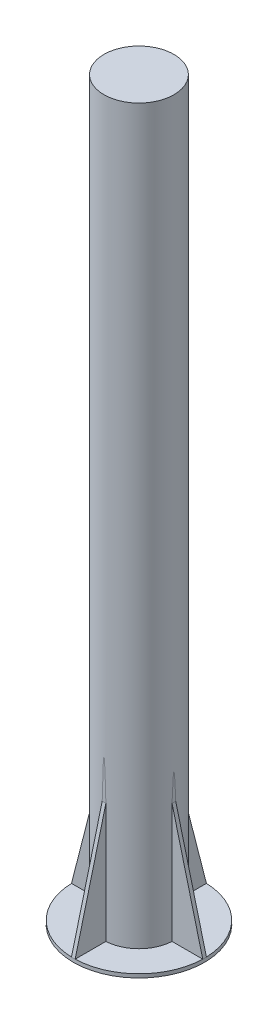
ISO-10303-21;
HEADER;
FILE_DESCRIPTION(('STEP AP214'),'2;1');
FILE_NAME('part.step','',(''),(''),'','','');
FILE_SCHEMA(('AUTOMOTIVE_DESIGN { 1 0 10303 214 1 1 1 1 }'));
ENDSEC;
DATA;
#1=APPLICATION_CONTEXT('core data for automotive mechanical design processes');
#2=APPLICATION_PROTOCOL_DEFINITION('international standard','automotive_design',2000,#1);
#3=PRODUCT_CONTEXT('',#1,'mechanical');
#4=PRODUCT('Part','Part','',(#3));
#5=PRODUCT_RELATED_PRODUCT_CATEGORY('part','',(#4));
#6=PRODUCT_DEFINITION_FORMATION('','',#4);
#7=PRODUCT_DEFINITION_CONTEXT('part definition',#1,'design');
#8=PRODUCT_DEFINITION('design','',#6,#7);
#9=PRODUCT_DEFINITION_SHAPE('','',#8);
#10=(LENGTH_UNIT() NAMED_UNIT(*) SI_UNIT(.MILLI.,.METRE.));
#11=(NAMED_UNIT(*) PLANE_ANGLE_UNIT() SI_UNIT($,.RADIAN.));
#12=(NAMED_UNIT(*) SI_UNIT($,.STERADIAN.) SOLID_ANGLE_UNIT());
#13=UNCERTAINTY_MEASURE_WITH_UNIT(LENGTH_MEASURE(1.E-05),#10,'distance_accuracy_value','');
#14=(GEOMETRIC_REPRESENTATION_CONTEXT(3) GLOBAL_UNCERTAINTY_ASSIGNED_CONTEXT((#13)) GLOBAL_UNIT_ASSIGNED_CONTEXT((#10,
#11,#12)) REPRESENTATION_CONTEXT('',''));
#15=CARTESIAN_POINT('',(0.,0.,0.));
#16=DIRECTION('',(0.,0.,1.));
#17=DIRECTION('',(1.,0.,0.));
#18=AXIS2_PLACEMENT_3D('',#15,#16,#17);
#19=CARTESIAN_POINT('',(0.,6.,0.));
#20=DIRECTION('',(0.,1.,0.));
#21=DIRECTION('',(0.,0.,1.));
#22=AXIS2_PLACEMENT_3D('',#19,#20,#21);
#23=PLANE('',#22);
#24=CARTESIAN_POINT('',(0.,6.,0.));
#25=DIRECTION('',(0.,1.,0.));
#26=DIRECTION('',(0.,0.,1.));
#27=AXIS2_PLACEMENT_3D('',#24,#25,#26);
#28=CIRCLE('',#27,57.);
#29=CARTESIAN_POINT('',(-56.9209978830308,6.00000000000001,3.));
#30=VERTEX_POINT('',#29);
#31=CARTESIAN_POINT('',(-2.99999999999997,6.00000000000001,56.9209978830308));
#32=VERTEX_POINT('',#31);
#33=EDGE_CURVE('E222',#30,#32,#28,.T.);
#34=ORIENTED_EDGE('',*,*,#33,.F.);
#35=DIRECTION('',(1.,0.,0.));
#36=VECTOR('',#35,1.);
#37=CARTESIAN_POINT('',(-107.,6.,3.));
#38=LINE('',#37,#36);
#39=CARTESIAN_POINT('',(-106.957935656967,6.,3.));
#40=VERTEX_POINT('',#39);
#41=EDGE_CURVE('E55',#40,#30,#38,.T.);
#42=ORIENTED_EDGE('',*,*,#41,.F.);
#43=CARTESIAN_POINT('',(0.,6.,0.));
#44=DIRECTION('',(0.,1.,0.));
#45=DIRECTION('',(0.,0.,1.));
#46=AXIS2_PLACEMENT_3D('',#43,#44,#45);
#47=CIRCLE('',#46,107.);
#48=CARTESIAN_POINT('',(-2.99999999999996,6.,106.957935656967));
#49=VERTEX_POINT('',#48);
#50=EDGE_CURVE('E227',#40,#49,#47,.T.);
#51=ORIENTED_EDGE('',*,*,#50,.T.);
#52=DIRECTION('',(0.,0.,1.));
#53=VECTOR('',#52,1.);
#54=CARTESIAN_POINT('',(-2.99999999999998,6.,3.));
#55=LINE('',#54,#53);
#56=EDGE_CURVE('E288',#32,#49,#55,.T.);
#57=ORIENTED_EDGE('',*,*,#56,.F.);
#58=EDGE_LOOP('',(#34,#42,#51,#57));
#59=FACE_BOUND('',#58,.T.);
#60=ADVANCED_FACE('F39',(#59),#23,.T.);
#61=CARTESIAN_POINT('',(3.00000000000003,6.00000000000001,56.9209978830308));
#62=VERTEX_POINT('',#61);
#63=CARTESIAN_POINT('',(56.9209978830308,6.00000000000001,3.));
#64=VERTEX_POINT('',#63);
#65=EDGE_CURVE('E216',#62,#64,#28,.T.);
#66=ORIENTED_EDGE('',*,*,#65,.F.);
#67=DIRECTION('',(0.,0.,-1.));
#68=VECTOR('',#67,1.);
#69=CARTESIAN_POINT('',(3.00000000000004,6.,107.));
#70=LINE('',#69,#68);
#71=CARTESIAN_POINT('',(3.00000000000004,6.,106.957935656967));
#72=VERTEX_POINT('',#71);
#73=EDGE_CURVE('E305',#72,#62,#70,.T.);
#74=ORIENTED_EDGE('',*,*,#73,.F.);
#75=CARTESIAN_POINT('',(106.957935656967,6.,3.));
#76=VERTEX_POINT('',#75);
#77=EDGE_CURVE('E226',#72,#76,#47,.T.);
#78=ORIENTED_EDGE('',*,*,#77,.T.);
#79=DIRECTION('',(1.,0.,0.));
#80=VECTOR('',#79,1.);
#81=CARTESIAN_POINT('',(3.00000000000002,6.,2.99999999999999));
#82=LINE('',#81,#80);
#83=EDGE_CURVE('E314',#64,#76,#82,.T.);
#84=ORIENTED_EDGE('',*,*,#83,.F.);
#85=EDGE_LOOP('',(#66,#74,#78,#84));
#86=FACE_BOUND('',#85,.T.);
#87=ADVANCED_FACE('F429',(#86),#23,.T.);
#88=CARTESIAN_POINT('',(56.9209978830308,6.00000000000001,-3.00000000000001));
#89=VERTEX_POINT('',#88);
#90=CARTESIAN_POINT('',(3.00000000000001,6.00000000000001,-56.9209978830308));
#91=VERTEX_POINT('',#90);
#92=EDGE_CURVE('E221',#89,#91,#28,.T.);
#93=ORIENTED_EDGE('',*,*,#92,.F.);
#94=DIRECTION('',(-1.,0.,0.));
#95=VECTOR('',#94,1.);
#96=CARTESIAN_POINT('',(107.,6.,-3.00000000000001));
#97=LINE('',#96,#95);
#98=CARTESIAN_POINT('',(106.957935656967,6.,-3.00000000000001));
#99=VERTEX_POINT('',#98);
#100=EDGE_CURVE('E258',#99,#89,#97,.T.);
#101=ORIENTED_EDGE('',*,*,#100,.F.);
#102=CARTESIAN_POINT('',(3.,6.,-106.957935656967));
#103=VERTEX_POINT('',#102);
#104=EDGE_CURVE('E334',#99,#103,#47,.T.);
#105=ORIENTED_EDGE('',*,*,#104,.T.);
#106=DIRECTION('',(0.,0.,-1.));
#107=VECTOR('',#106,1.);
#108=CARTESIAN_POINT('',(3.00000000000002,6.,-3.));
#109=LINE('',#108,#107);
#110=EDGE_CURVE('E180',#91,#103,#109,.T.);
#111=ORIENTED_EDGE('',*,*,#110,.F.);
#112=EDGE_LOOP('',(#93,#101,#105,#111));
#113=FACE_BOUND('',#112,.T.);
#114=ADVANCED_FACE('F269',(#113),#23,.T.);
#115=CARTESIAN_POINT('',(-2.99999999999999,6.00000000000001,-56.9209978830308));
#116=VERTEX_POINT('',#115);
#117=CARTESIAN_POINT('',(-56.9209978830308,6.00000000000001,-3.));
#118=VERTEX_POINT('',#117);
#119=EDGE_CURVE('E274',#116,#118,#28,.T.);
#120=ORIENTED_EDGE('',*,*,#119,.F.);
#121=DIRECTION('',(0.,0.,1.));
#122=VECTOR('',#121,1.);
#123=CARTESIAN_POINT('',(-3.,6.,-107.));
#124=LINE('',#123,#122);
#125=CARTESIAN_POINT('',(-3.,6.,-106.957935656967));
#126=VERTEX_POINT('',#125);
#127=EDGE_CURVE('E197',#126,#116,#124,.T.);
#128=ORIENTED_EDGE('',*,*,#127,.F.);
#129=CARTESIAN_POINT('',(-106.957935656967,6.,-3.));
#130=VERTEX_POINT('',#129);
#131=EDGE_CURVE('E340',#126,#130,#47,.T.);
#132=ORIENTED_EDGE('',*,*,#131,.T.);
#133=DIRECTION('',(-1.,0.,0.));
#134=VECTOR('',#133,1.);
#135=CARTESIAN_POINT('',(-2.99999999999998,6.,-3.));
#136=LINE('',#135,#134);
#137=EDGE_CURVE('E202',#118,#130,#136,.T.);
#138=ORIENTED_EDGE('',*,*,#137,.F.);
#139=EDGE_LOOP('',(#120,#128,#132,#138));
#140=FACE_BOUND('',#139,.T.);
#141=ADVANCED_FACE('F421',(#140),#23,.T.);
#142=CARTESIAN_POINT('',(0.,1200.,0.));
#143=DIRECTION('',(0.,-1.,0.));
#144=DIRECTION('',(0.,0.,-1.));
#145=AXIS2_PLACEMENT_3D('',#142,#143,#144);
#146=CYLINDRICAL_SURFACE('',#145,57.);
#147=DIRECTION('',(0.,-1.,0.));
#148=VECTOR('',#147,1.);
#149=CARTESIAN_POINT('',(3.00000000000001,1200.,-56.9209978830308));
#150=LINE('',#149,#148);
#151=CARTESIAN_POINT('',(3.,201.,-56.9209978830308));
#152=VERTEX_POINT('',#151);
#153=EDGE_CURVE('E245',#152,#91,#150,.T.);
#154=ORIENTED_EDGE('',*,*,#153,.F.);
#155=CARTESIAN_POINT('',(0.,-46487.07236168,0.));
#156=DIRECTION('',(0.,0.00121917553457105,0.999999256805232));
#157=DIRECTION('',(0.,-0.999999256805232,0.00121917553457105));
#158=AXIS2_PLACEMENT_3D('',#155,#156,#157);
#159=ELLIPSE('',#158,46752.9066846431,57.);
#160=CARTESIAN_POINT('',(-2.99999999999999,201.,-56.9209978830308));
#161=VERTEX_POINT('',#160);
#162=EDGE_CURVE('E405',#152,#161,#159,.T.);
#163=ORIENTED_EDGE('',*,*,#162,.T.);
#164=DIRECTION('',(0.,-1.,0.));
#165=VECTOR('',#164,1.);
#166=CARTESIAN_POINT('',(-2.99999999999999,1200.,-56.9209978830308));
#167=LINE('',#166,#165);
#168=EDGE_CURVE('E188',#116,#161,#167,.F.);
#169=ORIENTED_EDGE('',*,*,#168,.F.);
#170=ORIENTED_EDGE('',*,*,#119,.T.);
#171=DIRECTION('',(0.,-1.,0.));
#172=VECTOR('',#171,1.);
#173=CARTESIAN_POINT('',(-56.9209978830308,1200.,-3.));
#174=LINE('',#173,#172);
#175=CARTESIAN_POINT('',(-56.9209978830308,201.,-3.));
#176=VERTEX_POINT('',#175);
#177=EDGE_CURVE('E237',#176,#118,#174,.T.);
#178=ORIENTED_EDGE('',*,*,#177,.F.);
#179=CARTESIAN_POINT('',(0.,-30744.5451322641,0.));
#180=DIRECTION('',(0.999998308322249,0.00183938920279995,0.));
#181=DIRECTION('',(0.00183938920279995,-0.99999830832225,0.));
#182=AXIS2_PLACEMENT_3D('',#179,#180,#181);
#183=ELLIPSE('',#182,30988.5476729088,57.);
#184=CARTESIAN_POINT('',(-56.9209978830308,201.,3.));
#185=VERTEX_POINT('',#184);
#186=EDGE_CURVE('E372',#176,#185,#183,.T.);
#187=ORIENTED_EDGE('',*,*,#186,.T.);
#188=DIRECTION('',(0.,-1.,0.));
#189=VECTOR('',#188,1.);
#190=CARTESIAN_POINT('',(-56.9209978830308,1200.,3.));
#191=LINE('',#190,#189);
#192=EDGE_CURVE('E240',#30,#185,#191,.F.);
#193=ORIENTED_EDGE('',*,*,#192,.F.);
#194=ORIENTED_EDGE('',*,*,#33,.T.);
#195=DIRECTION('',(0.,-1.,0.));
#196=VECTOR('',#195,1.);
#197=CARTESIAN_POINT('',(-2.99999999999997,1200.,56.9209978830308));
#198=LINE('',#197,#196);
#199=CARTESIAN_POINT('',(-2.99999999999996,201.,56.9209978830308));
#200=VERTEX_POINT('',#199);
#201=EDGE_CURVE('E234',#200,#32,#198,.T.);
#202=ORIENTED_EDGE('',*,*,#201,.F.);
#203=CARTESIAN_POINT('',(0.,-46487.0723616801,0.));
#204=DIRECTION('',(0.,0.00121917553457105,-0.999999256805232));
#205=DIRECTION('',(0.,-0.999999256805232,-0.00121917553457105));
#206=AXIS2_PLACEMENT_3D('',#203,#204,#205);
#207=ELLIPSE('',#206,46752.9066846431,57.);
#208=CARTESIAN_POINT('',(3.00000000000003,201.,56.9209978830308));
#209=VERTEX_POINT('',#208);
#210=EDGE_CURVE('E393',#200,#209,#207,.T.);
#211=ORIENTED_EDGE('',*,*,#210,.T.);
#212=DIRECTION('',(0.,-1.,0.));
#213=VECTOR('',#212,1.);
#214=CARTESIAN_POINT('',(3.00000000000003,1200.,56.9209978830308));
#215=LINE('',#214,#213);
#216=EDGE_CURVE('E220',#62,#209,#215,.F.);
#217=ORIENTED_EDGE('',*,*,#216,.F.);
#218=ORIENTED_EDGE('',*,*,#65,.T.);
#219=DIRECTION('',(0.,-1.,0.));
#220=VECTOR('',#219,1.);
#221=CARTESIAN_POINT('',(56.9209978830308,1200.,3.));
#222=LINE('',#221,#220);
#223=CARTESIAN_POINT('',(56.9209978830308,201.,3.));
#224=VERTEX_POINT('',#223);
#225=EDGE_CURVE('E11',#224,#64,#222,.T.);
#226=ORIENTED_EDGE('',*,*,#225,.F.);
#227=CARTESIAN_POINT('',(0.,-30744.5451322614,0.));
#228=DIRECTION('',(-0.999998308322249,0.00183938920280011,0.));
#229=DIRECTION('',(-0.00183938920280011,-0.99999830832225,0.));
#230=AXIS2_PLACEMENT_3D('',#227,#228,#229);
#231=ELLIPSE('',#230,30988.5476729061,57.);
#232=CARTESIAN_POINT('',(56.9209978830308,201.,-3.));
#233=VERTEX_POINT('',#232);
#234=EDGE_CURVE('E266',#224,#233,#231,.T.);
#235=ORIENTED_EDGE('',*,*,#234,.T.);
#236=DIRECTION('',(0.,-1.,0.));
#237=VECTOR('',#236,1.);
#238=CARTESIAN_POINT('',(56.9209978830308,1200.,-3.00000000000001));
#239=LINE('',#238,#237);
#240=EDGE_CURVE('E48',#89,#233,#239,.F.);
#241=ORIENTED_EDGE('',*,*,#240,.F.);
#242=ORIENTED_EDGE('',*,*,#92,.T.);
#243=EDGE_LOOP('',(#154,#163,#169,#170,#178,#187,#193,#194,#202,#211,#217,#218,#226,#235,#241,#242));
#244=FACE_BOUND('',#243,.T.);
#245=CARTESIAN_POINT('',(0.,1200.,0.));
#246=DIRECTION('',(0.,1.,0.));
#247=DIRECTION('',(0.,0.,1.));
#248=AXIS2_PLACEMENT_3D('',#245,#246,#247);
#249=CIRCLE('',#248,57.);
#250=CARTESIAN_POINT('',(0.,1200.,57.));
#251=VERTEX_POINT('',#250);
#252=EDGE_CURVE('E211',#251,#251,#249,.T.);
#253=ORIENTED_EDGE('',*,*,#252,.F.);
#254=EDGE_LOOP('',(#253));
#255=FACE_BOUND('',#254,.T.);
#256=ADVANCED_FACE('F263',(#244,#255),#146,.T.);
#257=CARTESIAN_POINT('',(0.,6.,0.));
#258=DIRECTION('',(0.,-1.,0.));
#259=DIRECTION('',(0.,0.,-1.));
#260=AXIS2_PLACEMENT_3D('',#257,#258,#259);
#261=CYLINDRICAL_SURFACE('',#260,107.);
#262=CARTESIAN_POINT('',(0.,6.,107.));
#263=VERTEX_POINT('',#262);
#264=EDGE_CURVE('E223',#263,#72,#47,.T.);
#265=ORIENTED_EDGE('',*,*,#264,.F.);
#266=CARTESIAN_POINT('',(0.,6.,0.));
#267=DIRECTION('',(0.,1.,0.));
#268=DIRECTION('',(0.,0.,1.));
#269=AXIS2_PLACEMENT_3D('',#266,#267,#268);
#270=CIRCLE('',#269,107.);
#271=EDGE_CURVE('E206',#49,#263,#270,.T.);
#272=ORIENTED_EDGE('',*,*,#271,.F.);
#273=ORIENTED_EDGE('',*,*,#50,.F.);
#274=CARTESIAN_POINT('',(-107.,6.,0.));
#275=VERTEX_POINT('',#274);
#276=EDGE_CURVE('E63',#275,#40,#270,.T.);
#277=ORIENTED_EDGE('',*,*,#276,.F.);
#278=EDGE_CURVE('E353',#130,#275,#270,.T.);
#279=ORIENTED_EDGE('',*,*,#278,.F.);
#280=ORIENTED_EDGE('',*,*,#131,.F.);
#281=CARTESIAN_POINT('',(0.,6.,-107.));
#282=VERTEX_POINT('',#281);
#283=EDGE_CURVE('E194',#282,#126,#270,.T.);
#284=ORIENTED_EDGE('',*,*,#283,.F.);
#285=EDGE_CURVE('E330',#103,#282,#270,.T.);
#286=ORIENTED_EDGE('',*,*,#285,.F.);
#287=ORIENTED_EDGE('',*,*,#104,.F.);
#288=CARTESIAN_POINT('',(107.,6.,0.));
#289=VERTEX_POINT('',#288);
#290=EDGE_CURVE('E338',#289,#99,#270,.T.);
#291=ORIENTED_EDGE('',*,*,#290,.F.);
#292=EDGE_CURVE('E210',#76,#289,#270,.T.);
#293=ORIENTED_EDGE('',*,*,#292,.F.);
#294=ORIENTED_EDGE('',*,*,#77,.F.);
#295=EDGE_LOOP('',(#265,#272,#273,#277,#279,#280,#284,#286,#287,#291,#293,#294));
#296=FACE_BOUND('',#295,.T.);
#297=CARTESIAN_POINT('',(0.,0.,0.));
#298=DIRECTION('',(0.,1.,0.));
#299=DIRECTION('',(0.,0.,1.));
#300=AXIS2_PLACEMENT_3D('',#297,#298,#299);
#301=CIRCLE('',#300,107.);
#302=CARTESIAN_POINT('',(0.,0.,107.));
#303=VERTEX_POINT('',#302);
#304=EDGE_CURVE('E215',#303,#303,#301,.T.);
#305=ORIENTED_EDGE('',*,*,#304,.T.);
#306=EDGE_LOOP('',(#305));
#307=FACE_BOUND('',#306,.T.);
#308=ADVANCED_FACE('F41',(#296,#307),#261,.T.);
#309=CARTESIAN_POINT('',(0.,0.,0.));
#310=DIRECTION('',(0.,1.,0.));
#311=DIRECTION('',(0.,0.,1.));
#312=AXIS2_PLACEMENT_3D('',#309,#310,#311);
#313=PLANE('',#312);
#314=ORIENTED_EDGE('',*,*,#304,.F.);
#315=EDGE_LOOP('',(#314));
#316=FACE_BOUND('',#315,.T.);
#317=ADVANCED_FACE('F502',(#316),#313,.F.);
#318=CARTESIAN_POINT('',(0.,1200.,0.));
#319=DIRECTION('',(0.,1.,0.));
#320=DIRECTION('',(0.,0.,1.));
#321=AXIS2_PLACEMENT_3D('',#318,#319,#320);
#322=PLANE('',#321);
#323=ORIENTED_EDGE('',*,*,#252,.T.);
#324=EDGE_LOOP('',(#323));
#325=FACE_BOUND('',#324,.T.);
#326=ADVANCED_FACE('F496',(#325),#322,.T.);
#327=CARTESIAN_POINT('',(3.00000000000004,201.,107.));
#328=DIRECTION('',(-1.,0.,0.));
#329=DIRECTION('',(0.,0.,1.));
#330=AXIS2_PLACEMENT_3D('',#327,#328,#329);
#331=PLANE('',#330);
#332=ORIENTED_EDGE('',*,*,#216,.T.);
#333=DIRECTION('',(0.,-0.968569386403329,0.248743530010891));
#334=VECTOR('',#333,1.);
#335=CARTESIAN_POINT('',(3.00000000000003,188.934697974156,60.0195531942828));
#336=LINE('',#335,#334);
#337=CARTESIAN_POINT('',(3.00000000000004,6.,107.));
#338=VERTEX_POINT('',#337);
#339=EDGE_CURVE('E401',#209,#338,#336,.T.);
#340=ORIENTED_EDGE('',*,*,#339,.T.);
#341=EDGE_CURVE('E306',#338,#72,#70,.T.);
#342=ORIENTED_EDGE('',*,*,#341,.T.);
#343=ORIENTED_EDGE('',*,*,#73,.T.);
#344=EDGE_LOOP('',(#332,#340,#342,#343));
#345=FACE_BOUND('',#344,.T.);
#346=ADVANCED_FACE('F445',(#345),#331,.F.);
#347=CARTESIAN_POINT('',(-2.99999999999998,201.,3.));
#348=DIRECTION('',(1.,0.,0.));
#349=DIRECTION('',(0.,0.,-1.));
#350=AXIS2_PLACEMENT_3D('',#347,#348,#349);
#351=PLANE('',#350);
#352=CARTESIAN_POINT('',(-2.99999999999995,6.,107.));
#353=VERTEX_POINT('',#352);
#354=EDGE_CURVE('E294',#49,#353,#55,.T.);
#355=ORIENTED_EDGE('',*,*,#354,.T.);
#356=DIRECTION('',(0.,-0.968569386403329,0.248743530010891));
#357=VECTOR('',#356,1.);
#358=CARTESIAN_POINT('',(-2.99999999999995,6.,107.));
#359=LINE('',#358,#357);
#360=EDGE_CURVE('E414',#200,#353,#359,.T.);
#361=ORIENTED_EDGE('',*,*,#360,.F.);
#362=ORIENTED_EDGE('',*,*,#201,.T.);
#363=ORIENTED_EDGE('',*,*,#56,.T.);
#364=EDGE_LOOP('',(#355,#361,#362,#363));
#365=FACE_BOUND('',#364,.T.);
#366=ADVANCED_FACE('F480',(#365),#351,.F.);
#367=CARTESIAN_POINT('',(0.,6.,0.));
#368=DIRECTION('',(0.,1.,0.));
#369=DIRECTION('',(0.,0.,1.));
#370=AXIS2_PLACEMENT_3D('',#367,#368,#369);
#371=PLANE('',#370);
#372=ORIENTED_EDGE('',*,*,#354,.F.);
#373=ORIENTED_EDGE('',*,*,#271,.T.);
#374=DIRECTION('',(1.,0.,0.));
#375=VECTOR('',#374,1.);
#376=CARTESIAN_POINT('',(-2.99999999999996,6.,107.));
#377=LINE('',#376,#375);
#378=EDGE_CURVE('E298',#353,#263,#377,.T.);
#379=ORIENTED_EDGE('',*,*,#378,.F.);
#380=EDGE_LOOP('',(#372,#373,#379));
#381=FACE_BOUND('',#380,.T.);
#382=ADVANCED_FACE('F477',(#381),#371,.F.);
#383=EDGE_CURVE('E293',#263,#338,#377,.T.);
#384=ORIENTED_EDGE('',*,*,#383,.F.);
#385=ORIENTED_EDGE('',*,*,#264,.T.);
#386=ORIENTED_EDGE('',*,*,#341,.F.);
#387=EDGE_LOOP('',(#384,#385,#386));
#388=FACE_BOUND('',#387,.T.);
#389=ADVANCED_FACE('F475',(#388),#371,.F.);
#390=CARTESIAN_POINT('',(-2.99999999999998,201.,-3.));
#391=DIRECTION('',(0.,0.,1.));
#392=DIRECTION('',(1.,0.,0.));
#393=AXIS2_PLACEMENT_3D('',#390,#391,#392);
#394=PLANE('',#393);
#395=CARTESIAN_POINT('',(-107.,6.,-3.));
#396=VERTEX_POINT('',#395);
#397=EDGE_CURVE('E196',#130,#396,#136,.T.);
#398=ORIENTED_EDGE('',*,*,#397,.T.);
#399=DIRECTION('',(0.248743530010891,0.968569386403329,0.));
#400=VECTOR('',#399,1.);
#401=CARTESIAN_POINT('',(-53.5847254471658,213.990936270538,-3.));
#402=LINE('',#401,#400);
#403=EDGE_CURVE('E375',#396,#176,#402,.T.);
#404=ORIENTED_EDGE('',*,*,#403,.T.);
#405=ORIENTED_EDGE('',*,*,#177,.T.);
#406=ORIENTED_EDGE('',*,*,#137,.T.);
#407=EDGE_LOOP('',(#398,#404,#405,#406));
#408=FACE_BOUND('',#407,.T.);
#409=ADVANCED_FACE('F360',(#408),#394,.F.);
#410=CARTESIAN_POINT('',(-107.,201.,3.));
#411=DIRECTION('',(0.,0.,-1.));
#412=DIRECTION('',(-1.,0.,0.));
#413=AXIS2_PLACEMENT_3D('',#410,#411,#412);
#414=PLANE('',#413);
#415=ORIENTED_EDGE('',*,*,#192,.T.);
#416=DIRECTION('',(0.248743530010891,0.968569386403329,0.));
#417=VECTOR('',#416,1.);
#418=CARTESIAN_POINT('',(-56.9209978830308,201.,3.));
#419=LINE('',#418,#417);
#420=CARTESIAN_POINT('',(-107.,6.,3.));
#421=VERTEX_POINT('',#420);
#422=EDGE_CURVE('E389',#421,#185,#419,.T.);
#423=ORIENTED_EDGE('',*,*,#422,.F.);
#424=EDGE_CURVE('E300',#421,#40,#38,.T.);
#425=ORIENTED_EDGE('',*,*,#424,.T.);
#426=ORIENTED_EDGE('',*,*,#41,.T.);
#427=EDGE_LOOP('',(#415,#423,#425,#426));
#428=FACE_BOUND('',#427,.T.);
#429=ADVANCED_FACE('F484',(#428),#414,.F.);
#430=DIRECTION('',(0.,0.,1.));
#431=VECTOR('',#430,1.);
#432=CARTESIAN_POINT('',(-107.,6.,0.));
#433=LINE('',#432,#431);
#434=EDGE_CURVE('E366',#275,#421,#433,.T.);
#435=ORIENTED_EDGE('',*,*,#434,.F.);
#436=ORIENTED_EDGE('',*,*,#276,.T.);
#437=ORIENTED_EDGE('',*,*,#424,.F.);
#438=EDGE_LOOP('',(#435,#436,#437));
#439=FACE_BOUND('',#438,.T.);
#440=ADVANCED_FACE('F367',(#439),#371,.F.);
#441=ORIENTED_EDGE('',*,*,#397,.F.);
#442=ORIENTED_EDGE('',*,*,#278,.T.);
#443=EDGE_CURVE('E365',#396,#275,#433,.T.);
#444=ORIENTED_EDGE('',*,*,#443,.F.);
#445=EDGE_LOOP('',(#441,#442,#444));
#446=FACE_BOUND('',#445,.T.);
#447=ADVANCED_FACE('F364',(#446),#371,.F.);
#448=CARTESIAN_POINT('',(-3.,201.,-107.));
#449=DIRECTION('',(1.,0.,0.));
#450=DIRECTION('',(0.,0.,-1.));
#451=AXIS2_PLACEMENT_3D('',#448,#449,#450);
#452=PLANE('',#451);
#453=ORIENTED_EDGE('',*,*,#168,.T.);
#454=DIRECTION('',(0.,0.968569386403329,0.248743530010891));
#455=VECTOR('',#454,1.);
#456=CARTESIAN_POINT('',(-3.,6.,-107.));
#457=LINE('',#456,#455);
#458=CARTESIAN_POINT('',(-3.,6.,-107.));
#459=VERTEX_POINT('',#458);
#460=EDGE_CURVE('E171',#459,#161,#457,.T.);
#461=ORIENTED_EDGE('',*,*,#460,.F.);
#462=EDGE_CURVE('E185',#459,#126,#124,.T.);
#463=ORIENTED_EDGE('',*,*,#462,.T.);
#464=ORIENTED_EDGE('',*,*,#127,.T.);
#465=EDGE_LOOP('',(#453,#461,#463,#464));
#466=FACE_BOUND('',#465,.T.);
#467=ADVANCED_FACE('F184',(#466),#452,.F.);
#468=CARTESIAN_POINT('',(3.00000000000002,201.,-3.));
#469=DIRECTION('',(-1.,0.,0.));
#470=DIRECTION('',(0.,0.,1.));
#471=AXIS2_PLACEMENT_3D('',#468,#469,#470);
#472=PLANE('',#471);
#473=CARTESIAN_POINT('',(3.,6.,-107.));
#474=VERTEX_POINT('',#473);
#475=EDGE_CURVE('E321',#103,#474,#109,.T.);
#476=ORIENTED_EDGE('',*,*,#475,.T.);
#477=DIRECTION('',(0.,0.968569386403329,0.248743530010891));
#478=VECTOR('',#477,1.);
#479=CARTESIAN_POINT('',(3.00000000000001,213.990936270538,-53.5847254471658));
#480=LINE('',#479,#478);
#481=EDGE_CURVE('E408',#474,#152,#480,.T.);
#482=ORIENTED_EDGE('',*,*,#481,.T.);
#483=ORIENTED_EDGE('',*,*,#153,.T.);
#484=ORIENTED_EDGE('',*,*,#110,.T.);
#485=EDGE_LOOP('',(#476,#482,#483,#484));
#486=FACE_BOUND('',#485,.T.);
#487=ADVANCED_FACE('F328',(#486),#472,.F.);
#488=DIRECTION('',(-1.,0.,0.));
#489=VECTOR('',#488,1.);
#490=CARTESIAN_POINT('',(0.,6.,-107.));
#491=LINE('',#490,#489);
#492=EDGE_CURVE('E167',#282,#459,#491,.T.);
#493=ORIENTED_EDGE('',*,*,#492,.F.);
#494=ORIENTED_EDGE('',*,*,#283,.T.);
#495=ORIENTED_EDGE('',*,*,#462,.F.);
#496=EDGE_LOOP('',(#493,#494,#495));
#497=FACE_BOUND('',#496,.T.);
#498=ADVANCED_FACE('F193',(#497),#371,.F.);
#499=ORIENTED_EDGE('',*,*,#475,.F.);
#500=ORIENTED_EDGE('',*,*,#285,.T.);
#501=EDGE_CURVE('E174',#474,#282,#491,.T.);
#502=ORIENTED_EDGE('',*,*,#501,.F.);
#503=EDGE_LOOP('',(#499,#500,#502));
#504=FACE_BOUND('',#503,.T.);
#505=ADVANCED_FACE('F493',(#504),#371,.F.);
#506=CARTESIAN_POINT('',(3.00000000000002,201.,2.99999999999999));
#507=DIRECTION('',(0.,0.,-1.));
#508=DIRECTION('',(-1.,0.,0.));
#509=AXIS2_PLACEMENT_3D('',#506,#507,#508);
#510=PLANE('',#509);
#511=CARTESIAN_POINT('',(107.,6.,3.));
#512=VERTEX_POINT('',#511);
#513=EDGE_CURVE('E310',#76,#512,#82,.T.);
#514=ORIENTED_EDGE('',*,*,#513,.T.);
#515=DIRECTION('',(0.248743530010891,-0.968569386403329,0.));
#516=VECTOR('',#515,1.);
#517=CARTESIAN_POINT('',(107.,6.,3.));
#518=LINE('',#517,#516);
#519=EDGE_CURVE('E390',#224,#512,#518,.T.);
#520=ORIENTED_EDGE('',*,*,#519,.F.);
#521=ORIENTED_EDGE('',*,*,#225,.T.);
#522=ORIENTED_EDGE('',*,*,#83,.T.);
#523=EDGE_LOOP('',(#514,#520,#521,#522));
#524=FACE_BOUND('',#523,.T.);
#525=ADVANCED_FACE('F463',(#524),#510,.F.);
#526=CARTESIAN_POINT('',(107.,201.,-3.00000000000001));
#527=DIRECTION('',(0.,0.,1.));
#528=DIRECTION('',(1.,0.,0.));
#529=AXIS2_PLACEMENT_3D('',#526,#527,#528);
#530=PLANE('',#529);
#531=ORIENTED_EDGE('',*,*,#240,.T.);
#532=DIRECTION('',(0.248743530010891,-0.968569386403329,0.));
#533=VECTOR('',#532,1.);
#534=CARTESIAN_POINT('',(60.0195531942828,188.934697974156,-3.00000000000001));
#535=LINE('',#534,#533);
#536=CARTESIAN_POINT('',(107.,6.,-3.));
#537=VERTEX_POINT('',#536);
#538=EDGE_CURVE('E255',#233,#537,#535,.T.);
#539=ORIENTED_EDGE('',*,*,#538,.T.);
#540=EDGE_CURVE('E319',#537,#99,#97,.T.);
#541=ORIENTED_EDGE('',*,*,#540,.T.);
#542=ORIENTED_EDGE('',*,*,#100,.T.);
#543=EDGE_LOOP('',(#531,#539,#541,#542));
#544=FACE_BOUND('',#543,.T.);
#545=ADVANCED_FACE('F252',(#544),#530,.F.);
#546=ORIENTED_EDGE('',*,*,#513,.F.);
#547=ORIENTED_EDGE('',*,*,#292,.T.);
#548=DIRECTION('',(0.,0.,-1.));
#549=VECTOR('',#548,1.);
#550=CARTESIAN_POINT('',(107.,6.,3.));
#551=LINE('',#550,#549);
#552=EDGE_CURVE('E315',#512,#289,#551,.T.);
#553=ORIENTED_EDGE('',*,*,#552,.F.);
#554=EDGE_LOOP('',(#546,#547,#553));
#555=FACE_BOUND('',#554,.T.);
#556=ADVANCED_FACE('F460',(#555),#371,.F.);
#557=EDGE_CURVE('E318',#289,#537,#551,.T.);
#558=ORIENTED_EDGE('',*,*,#557,.F.);
#559=ORIENTED_EDGE('',*,*,#290,.T.);
#560=ORIENTED_EDGE('',*,*,#540,.F.);
#561=EDGE_LOOP('',(#558,#559,#560));
#562=FACE_BOUND('',#561,.T.);
#563=ADVANCED_FACE('F457',(#562),#371,.F.);
#564=CARTESIAN_POINT('',(56.9209978830308,201.,-107.));
#565=DIRECTION('',(-0.999998308322249,0.00183938920280011,0.));
#566=DIRECTION('',(-0.00183938920280011,-0.999998308322249,0.));
#567=AXIS2_PLACEMENT_3D('',#564,#565,#566);
#568=PLANE('',#567);
#569=DIRECTION('',(0.,0.,1.));
#570=VECTOR('',#569,1.);
#571=CARTESIAN_POINT('',(56.9209978830308,201.,-107.));
#572=LINE('',#571,#570);
#573=EDGE_CURVE('E385',#233,#224,#572,.T.);
#574=ORIENTED_EDGE('',*,*,#573,.F.);
#575=ORIENTED_EDGE('',*,*,#234,.F.);
#576=EDGE_LOOP('',(#574,#575));
#577=FACE_BOUND('',#576,.T.);
#578=ADVANCED_FACE('F465',(#577),#568,.F.);
#579=CARTESIAN_POINT('',(107.,6.,-107.));
#580=DIRECTION('',(-0.968569386403329,-0.248743530010891,0.));
#581=DIRECTION('',(0.248743530010891,-0.968569386403329,0.));
#582=AXIS2_PLACEMENT_3D('',#579,#580,#581);
#583=PLANE('',#582);
#584=ORIENTED_EDGE('',*,*,#573,.T.);
#585=ORIENTED_EDGE('',*,*,#519,.T.);
#586=ORIENTED_EDGE('',*,*,#552,.T.);
#587=ORIENTED_EDGE('',*,*,#557,.T.);
#588=ORIENTED_EDGE('',*,*,#538,.F.);
#589=EDGE_LOOP('',(#584,#585,#586,#587,#588));
#590=FACE_BOUND('',#589,.T.);
#591=ADVANCED_FACE('F453',(#590),#583,.F.);
#592=CARTESIAN_POINT('',(-57.,243.950118008078,-107.));
#593=DIRECTION('',(0.999998308322249,0.00183938920279995,0.));
#594=DIRECTION('',(-0.00183938920279995,0.999998308322249,0.));
#595=AXIS2_PLACEMENT_3D('',#592,#593,#594);
#596=PLANE('',#595);
#597=DIRECTION('',(0.,0.,1.));
#598=VECTOR('',#597,1.);
#599=CARTESIAN_POINT('',(-56.9209978830308,201.,-107.));
#600=LINE('',#599,#598);
#601=EDGE_CURVE('E384',#176,#185,#600,.T.);
#602=ORIENTED_EDGE('',*,*,#601,.T.);
#603=ORIENTED_EDGE('',*,*,#186,.F.);
#604=EDGE_LOOP('',(#602,#603));
#605=FACE_BOUND('',#604,.T.);
#606=ADVANCED_FACE('F472',(#605),#596,.F.);
#607=CARTESIAN_POINT('',(-56.9209978830308,201.,-107.));
#608=DIRECTION('',(0.968569386403329,-0.248743530010891,0.));
#609=DIRECTION('',(0.248743530010891,0.968569386403329,0.));
#610=AXIS2_PLACEMENT_3D('',#607,#608,#609);
#611=PLANE('',#610);
#612=ORIENTED_EDGE('',*,*,#443,.T.);
#613=ORIENTED_EDGE('',*,*,#434,.T.);
#614=ORIENTED_EDGE('',*,*,#422,.T.);
#615=ORIENTED_EDGE('',*,*,#601,.F.);
#616=ORIENTED_EDGE('',*,*,#403,.F.);
#617=EDGE_LOOP('',(#612,#613,#614,#615,#616));
#618=FACE_BOUND('',#617,.T.);
#619=ADVANCED_FACE('F527',(#618),#611,.F.);
#620=CARTESIAN_POINT('',(107.,201.,-56.9209978830309));
#621=DIRECTION('',(0.,0.00121917553457105,0.999999256805232));
#622=DIRECTION('',(0.,-0.999999256805232,0.00121917553457105));
#623=AXIS2_PLACEMENT_3D('',#620,#621,#622);
#624=PLANE('',#623);
#625=DIRECTION('',(-1.,0.,0.));
#626=VECTOR('',#625,1.);
#627=CARTESIAN_POINT('',(107.,201.,-56.9209978830309));
#628=LINE('',#627,#626);
#629=EDGE_CURVE('E190',#152,#161,#628,.T.);
#630=ORIENTED_EDGE('',*,*,#629,.T.);
#631=ORIENTED_EDGE('',*,*,#162,.F.);
#632=EDGE_LOOP('',(#630,#631));
#633=FACE_BOUND('',#632,.T.);
#634=ADVANCED_FACE('F420',(#633),#624,.F.);
#635=CARTESIAN_POINT('',(107.,6.,-107.));
#636=DIRECTION('',(0.,-0.248743530010891,0.968569386403329));
#637=DIRECTION('',(0.,-0.968569386403329,-0.248743530010891));
#638=AXIS2_PLACEMENT_3D('',#635,#636,#637);
#639=PLANE('',#638);
#640=ORIENTED_EDGE('',*,*,#501,.T.);
#641=ORIENTED_EDGE('',*,*,#492,.T.);
#642=ORIENTED_EDGE('',*,*,#460,.T.);
#643=ORIENTED_EDGE('',*,*,#629,.F.);
#644=ORIENTED_EDGE('',*,*,#481,.F.);
#645=EDGE_LOOP('',(#640,#641,#642,#643,#644));
#646=FACE_BOUND('',#645,.T.);
#647=ADVANCED_FACE('F169',(#646),#639,.F.);
#648=CARTESIAN_POINT('',(107.,201.,56.9209978830308));
#649=DIRECTION('',(0.,0.00121917553457105,-0.999999256805232));
#650=DIRECTION('',(0.,0.999999256805232,0.00121917553457105));
#651=AXIS2_PLACEMENT_3D('',#648,#649,#650);
#652=PLANE('',#651);
#653=DIRECTION('',(-1.,0.,0.));
#654=VECTOR('',#653,1.);
#655=CARTESIAN_POINT('',(107.,201.,56.9209978830308));
#656=LINE('',#655,#654);
#657=EDGE_CURVE('E191',#209,#200,#656,.T.);
#658=ORIENTED_EDGE('',*,*,#657,.F.);
#659=ORIENTED_EDGE('',*,*,#210,.F.);
#660=EDGE_LOOP('',(#658,#659));
#661=FACE_BOUND('',#660,.T.);
#662=ADVANCED_FACE('F691',(#661),#652,.F.);
#663=CARTESIAN_POINT('',(107.,6.,107.));
#664=DIRECTION('',(0.,-0.248743530010891,-0.968569386403329));
#665=DIRECTION('',(0.,0.968569386403329,-0.248743530010891));
#666=AXIS2_PLACEMENT_3D('',#663,#664,#665);
#667=PLANE('',#666);
#668=ORIENTED_EDGE('',*,*,#657,.T.);
#669=ORIENTED_EDGE('',*,*,#360,.T.);
#670=ORIENTED_EDGE('',*,*,#378,.T.);
#671=ORIENTED_EDGE('',*,*,#383,.T.);
#672=ORIENTED_EDGE('',*,*,#339,.F.);
#673=EDGE_LOOP('',(#668,#669,#670,#671,#672));
#674=FACE_BOUND('',#673,.T.);
#675=ADVANCED_FACE('F700',(#674),#667,.F.);
#676=CLOSED_SHELL('',(#60,#87,#114,#141,#256,#308,#317,#326,#346,#366,#382,#389,#409,#429,#440,
#447,#467,#487,#498,#505,#525,#545,#556,#563,#578,#591,#606,#619,#634,#647,#662,#675));
#677=MANIFOLD_SOLID_BREP('B2',#676);
#678=ADVANCED_BREP_SHAPE_REPRESENTATION('',(#18,#677),#14);
#679=SHAPE_DEFINITION_REPRESENTATION(#9,#678);
ENDSEC;
END-ISO-10303-21;
